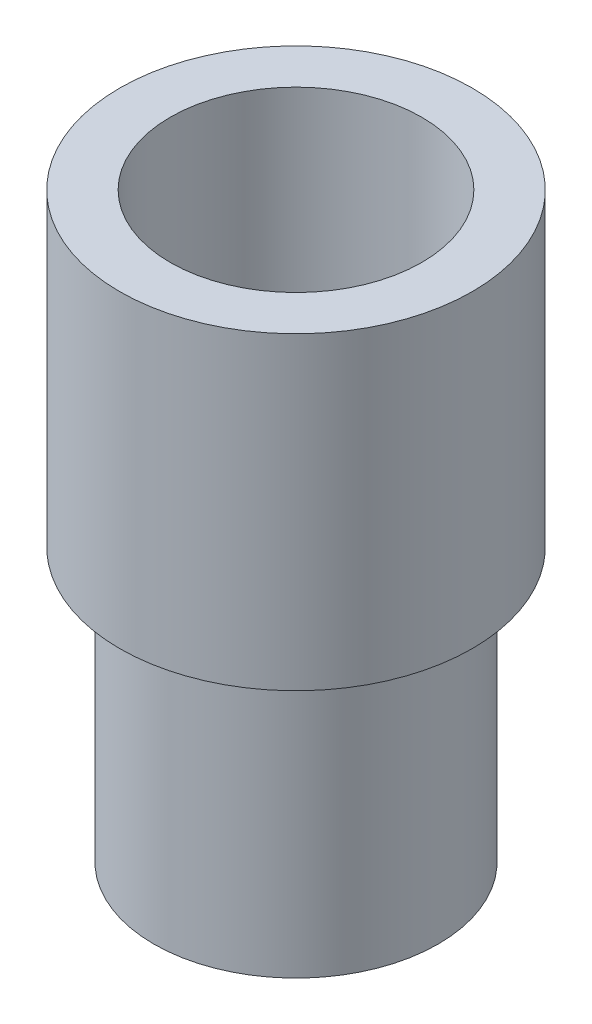
ISO-10303-21;
HEADER;
FILE_DESCRIPTION(('STEP AP214'),'2;1');
FILE_NAME('part.step','',(''),(''),'','','');
FILE_SCHEMA(('AUTOMOTIVE_DESIGN { 1 0 10303 214 1 1 1 1 }'));
ENDSEC;
DATA;
#1=APPLICATION_CONTEXT('core data for automotive mechanical design processes');
#2=APPLICATION_PROTOCOL_DEFINITION('international standard','automotive_design',2000,#1);
#3=PRODUCT_CONTEXT('',#1,'mechanical');
#4=PRODUCT('Part','Part','',(#3));
#5=PRODUCT_RELATED_PRODUCT_CATEGORY('part','',(#4));
#6=PRODUCT_DEFINITION_FORMATION('','',#4);
#7=PRODUCT_DEFINITION_CONTEXT('part definition',#1,'design');
#8=PRODUCT_DEFINITION('design','',#6,#7);
#9=PRODUCT_DEFINITION_SHAPE('','',#8);
#10=(LENGTH_UNIT() NAMED_UNIT(*) SI_UNIT(.MILLI.,.METRE.));
#11=(NAMED_UNIT(*) PLANE_ANGLE_UNIT() SI_UNIT($,.RADIAN.));
#12=(NAMED_UNIT(*) SI_UNIT($,.STERADIAN.) SOLID_ANGLE_UNIT());
#13=UNCERTAINTY_MEASURE_WITH_UNIT(LENGTH_MEASURE(1.E-05),#10,'distance_accuracy_value','');
#14=(GEOMETRIC_REPRESENTATION_CONTEXT(3) GLOBAL_UNCERTAINTY_ASSIGNED_CONTEXT((#13)) GLOBAL_UNIT_ASSIGNED_CONTEXT((#10,
#11,#12)) REPRESENTATION_CONTEXT('',''));
#15=CARTESIAN_POINT('',(0.,0.,0.));
#16=DIRECTION('',(0.,0.,1.));
#17=DIRECTION('',(1.,0.,0.));
#18=AXIS2_PLACEMENT_3D('',#15,#16,#17);
#19=CARTESIAN_POINT('',(0.,40.48,0.));
#20=DIRECTION('',(0.,1.,0.));
#21=DIRECTION('',(0.,0.,1.));
#22=AXIS2_PLACEMENT_3D('',#19,#20,#21);
#23=PLANE('',#22);
#24=CARTESIAN_POINT('',(0.,40.48,0.));
#25=DIRECTION('',(0.,-1.,0.));
#26=DIRECTION('',(0.,0.,-1.));
#27=AXIS2_PLACEMENT_3D('',#24,#25,#26);
#28=CIRCLE('',#27,14.0462);
#29=CARTESIAN_POINT('',(0.,40.48,-14.0462));
#30=VERTEX_POINT('',#29);
#31=EDGE_CURVE('E75',#30,#30,#28,.T.);
#32=ORIENTED_EDGE('',*,*,#31,.F.);
#33=EDGE_LOOP('',(#32));
#34=FACE_BOUND('',#33,.T.);
#35=ADVANCED_FACE('F43',(#34),#23,.T.);
#36=CARTESIAN_POINT('',(0.,30.48,0.));
#37=DIRECTION('',(0.,1.,0.));
#38=DIRECTION('',(0.,0.,1.));
#39=AXIS2_PLACEMENT_3D('',#36,#37,#38);
#40=PLANE('',#39);
#41=CARTESIAN_POINT('',(0.,30.48,0.));
#42=DIRECTION('',(0.,-1.,0.));
#43=DIRECTION('',(0.,0.,-1.));
#44=AXIS2_PLACEMENT_3D('',#41,#42,#43);
#45=CIRCLE('',#44,14.0462);
#46=CARTESIAN_POINT('',(0.,30.48,-14.0462));
#47=VERTEX_POINT('',#46);
#48=EDGE_CURVE('E10',#47,#47,#45,.T.);
#49=ORIENTED_EDGE('',*,*,#48,.T.);
#50=EDGE_LOOP('',(#49));
#51=FACE_BOUND('',#50,.T.);
#52=ADVANCED_FACE('F82',(#51),#40,.F.);
#53=CARTESIAN_POINT('',(0.,0.,0.));
#54=DIRECTION('',(0.,-1.,0.));
#55=DIRECTION('',(0.,0.,-1.));
#56=AXIS2_PLACEMENT_3D('',#53,#54,#55);
#57=CYLINDRICAL_SURFACE('',#56,14.0462);
#58=ORIENTED_EDGE('',*,*,#48,.F.);
#59=EDGE_LOOP('',(#58));
#60=FACE_BOUND('',#59,.T.);
#61=CARTESIAN_POINT('',(0.,0.,0.));
#62=DIRECTION('',(0.,-1.,0.));
#63=DIRECTION('',(0.,0.,-1.));
#64=AXIS2_PLACEMENT_3D('',#61,#62,#63);
#65=CIRCLE('',#64,14.0462);
#66=CARTESIAN_POINT('',(0.,0.,-14.0462));
#67=VERTEX_POINT('',#66);
#68=EDGE_CURVE('E50',#67,#67,#65,.T.);
#69=ORIENTED_EDGE('',*,*,#68,.T.);
#70=EDGE_LOOP('',(#69));
#71=FACE_BOUND('',#70,.T.);
#72=ADVANCED_FACE('F86',(#60,#71),#57,.F.);
#73=CARTESIAN_POINT('',(0.,0.,0.));
#74=DIRECTION('',(0.,-1.,0.));
#75=DIRECTION('',(0.,0.,-1.));
#76=AXIS2_PLACEMENT_3D('',#73,#74,#75);
#77=PLANE('',#76);
#78=CARTESIAN_POINT('',(0.,0.,0.));
#79=DIRECTION('',(0.,-1.,0.));
#80=DIRECTION('',(0.,0.,-1.));
#81=AXIS2_PLACEMENT_3D('',#78,#79,#80);
#82=CIRCLE('',#81,15.875);
#83=CARTESIAN_POINT('',(0.,0.,-15.875));
#84=VERTEX_POINT('',#83);
#85=EDGE_CURVE('E56',#84,#84,#82,.T.);
#86=ORIENTED_EDGE('',*,*,#85,.T.);
#87=EDGE_LOOP('',(#86));
#88=FACE_BOUND('',#87,.T.);
#89=ORIENTED_EDGE('',*,*,#68,.F.);
#90=EDGE_LOOP('',(#89));
#91=FACE_BOUND('',#90,.T.);
#92=ADVANCED_FACE('F91',(#88,#91),#77,.T.);
#93=CARTESIAN_POINT('',(0.,0.,0.));
#94=DIRECTION('',(0.,-1.,0.));
#95=DIRECTION('',(0.,0.,-1.));
#96=AXIS2_PLACEMENT_3D('',#93,#94,#95);
#97=CYLINDRICAL_SURFACE('',#96,15.875);
#98=CARTESIAN_POINT('',(0.,30.48,0.));
#99=DIRECTION('',(0.,-1.,0.));
#100=DIRECTION('',(0.,0.,-1.));
#101=AXIS2_PLACEMENT_3D('',#98,#99,#100);
#102=CIRCLE('',#101,15.875);
#103=CARTESIAN_POINT('',(0.,30.48,-15.875));
#104=VERTEX_POINT('',#103);
#105=EDGE_CURVE('E60',#104,#104,#102,.T.);
#106=ORIENTED_EDGE('',*,*,#105,.T.);
#107=EDGE_LOOP('',(#106));
#108=FACE_BOUND('',#107,.T.);
#109=ORIENTED_EDGE('',*,*,#85,.F.);
#110=EDGE_LOOP('',(#109));
#111=FACE_BOUND('',#110,.T.);
#112=ADVANCED_FACE('F97',(#108,#111),#97,.T.);
#113=CARTESIAN_POINT('',(0.,30.48,0.));
#114=DIRECTION('',(0.,-1.,0.));
#115=DIRECTION('',(0.,0.,-1.));
#116=AXIS2_PLACEMENT_3D('',#113,#114,#115);
#117=PLANE('',#116);
#118=CARTESIAN_POINT('',(0.,30.48,0.));
#119=DIRECTION('',(0.,-1.,0.));
#120=DIRECTION('',(0.,0.,-1.));
#121=AXIS2_PLACEMENT_3D('',#118,#119,#120);
#122=CIRCLE('',#121,19.685);
#123=CARTESIAN_POINT('',(0.,30.48,-19.685));
#124=VERTEX_POINT('',#123);
#125=EDGE_CURVE('E65',#124,#124,#122,.T.);
#126=ORIENTED_EDGE('',*,*,#125,.T.);
#127=EDGE_LOOP('',(#126));
#128=FACE_BOUND('',#127,.T.);
#129=ORIENTED_EDGE('',*,*,#105,.F.);
#130=EDGE_LOOP('',(#129));
#131=FACE_BOUND('',#130,.T.);
#132=ADVANCED_FACE('F101',(#128,#131),#117,.T.);
#133=CARTESIAN_POINT('',(0.,0.,0.));
#134=DIRECTION('',(0.,-1.,0.));
#135=DIRECTION('',(0.,0.,-1.));
#136=AXIS2_PLACEMENT_3D('',#133,#134,#135);
#137=CYLINDRICAL_SURFACE('',#136,19.685);
#138=CARTESIAN_POINT('',(0.,65.,0.));
#139=DIRECTION('',(0.,-1.,0.));
#140=DIRECTION('',(0.,0.,-1.));
#141=AXIS2_PLACEMENT_3D('',#138,#139,#140);
#142=CIRCLE('',#141,19.685);
#143=CARTESIAN_POINT('',(0.,65.,-19.685));
#144=VERTEX_POINT('',#143);
#145=EDGE_CURVE('E69',#144,#144,#142,.T.);
#146=ORIENTED_EDGE('',*,*,#145,.T.);
#147=EDGE_LOOP('',(#146));
#148=FACE_BOUND('',#147,.T.);
#149=ORIENTED_EDGE('',*,*,#125,.F.);
#150=EDGE_LOOP('',(#149));
#151=FACE_BOUND('',#150,.T.);
#152=ADVANCED_FACE('F105',(#148,#151),#137,.T.);
#153=CARTESIAN_POINT('',(0.,65.,0.));
#154=DIRECTION('',(0.,-1.,0.));
#155=DIRECTION('',(0.,0.,-1.));
#156=AXIS2_PLACEMENT_3D('',#153,#154,#155);
#157=PLANE('',#156);
#158=ORIENTED_EDGE('',*,*,#145,.F.);
#159=EDGE_LOOP('',(#158));
#160=FACE_BOUND('',#159,.T.);
#161=CARTESIAN_POINT('',(0.,65.,0.));
#162=DIRECTION('',(0.,-1.,0.));
#163=DIRECTION('',(0.,0.,-1.));
#164=AXIS2_PLACEMENT_3D('',#161,#162,#163);
#165=CIRCLE('',#164,14.0462);
#166=CARTESIAN_POINT('',(0.,65.,-14.0462));
#167=VERTEX_POINT('',#166);
#168=EDGE_CURVE('E72',#167,#167,#165,.T.);
#169=ORIENTED_EDGE('',*,*,#168,.T.);
#170=EDGE_LOOP('',(#169));
#171=FACE_BOUND('',#170,.T.);
#172=ADVANCED_FACE('F109',(#160,#171),#157,.F.);
#173=CARTESIAN_POINT('',(0.,0.,0.));
#174=DIRECTION('',(0.,-1.,0.));
#175=DIRECTION('',(0.,0.,-1.));
#176=AXIS2_PLACEMENT_3D('',#173,#174,#175);
#177=CYLINDRICAL_SURFACE('',#176,14.0462);
#178=ORIENTED_EDGE('',*,*,#168,.F.);
#179=EDGE_LOOP('',(#178));
#180=FACE_BOUND('',#179,.T.);
#181=ORIENTED_EDGE('',*,*,#31,.T.);
#182=EDGE_LOOP('',(#181));
#183=FACE_BOUND('',#182,.T.);
#184=ADVANCED_FACE('F79',(#180,#183),#177,.F.);
#185=CLOSED_SHELL('',(#35,#52,#72,#92,#112,#132,#152,#172,#184));
#186=MANIFOLD_SOLID_BREP('B2',#185);
#187=ADVANCED_BREP_SHAPE_REPRESENTATION('',(#18,#186),#14);
#188=SHAPE_DEFINITION_REPRESENTATION(#9,#187);
ENDSEC;
END-ISO-10303-21;
